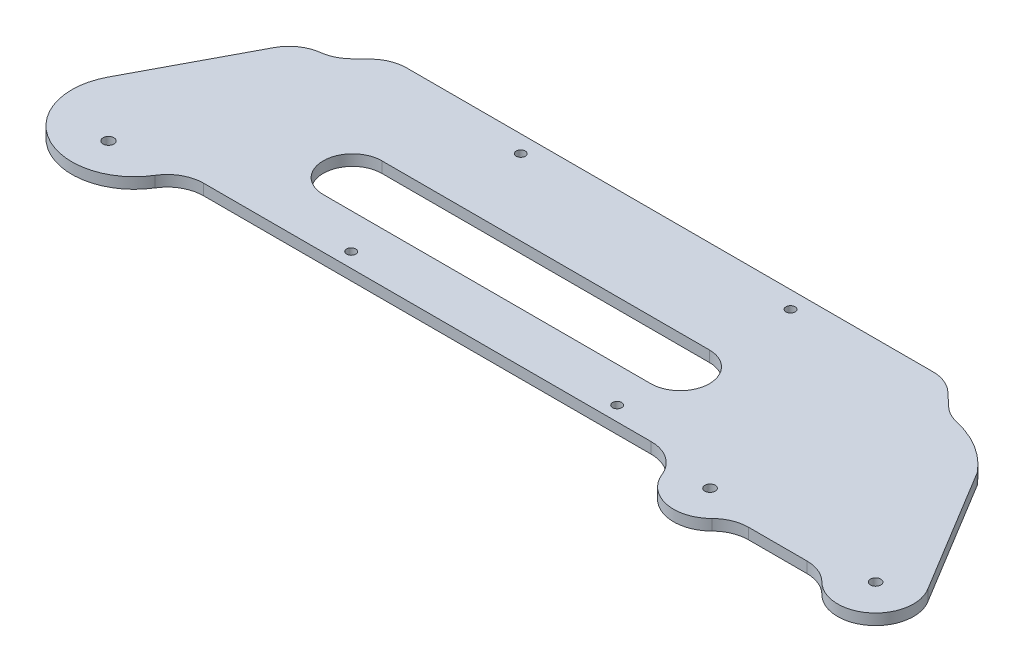
ISO-10303-21;
HEADER;
FILE_DESCRIPTION(('STEP AP214'),'2;1');
FILE_NAME('part.step','',(''),(''),'','','');
FILE_SCHEMA(('AUTOMOTIVE_DESIGN { 1 0 10303 214 1 1 1 1 }'));
ENDSEC;
DATA;
#1=APPLICATION_CONTEXT('core data for automotive mechanical design processes');
#2=APPLICATION_PROTOCOL_DEFINITION('international standard','automotive_design',2000,#1);
#3=PRODUCT_CONTEXT('',#1,'mechanical');
#4=PRODUCT('Part','Part','',(#3));
#5=PRODUCT_RELATED_PRODUCT_CATEGORY('part','',(#4));
#6=PRODUCT_DEFINITION_FORMATION('','',#4);
#7=PRODUCT_DEFINITION_CONTEXT('part definition',#1,'design');
#8=PRODUCT_DEFINITION('design','',#6,#7);
#9=PRODUCT_DEFINITION_SHAPE('','',#8);
#10=(LENGTH_UNIT() NAMED_UNIT(*) SI_UNIT(.MILLI.,.METRE.));
#11=(NAMED_UNIT(*) PLANE_ANGLE_UNIT() SI_UNIT($,.RADIAN.));
#12=(NAMED_UNIT(*) SI_UNIT($,.STERADIAN.) SOLID_ANGLE_UNIT());
#13=UNCERTAINTY_MEASURE_WITH_UNIT(LENGTH_MEASURE(1.E-05),#10,'distance_accuracy_value','');
#14=(GEOMETRIC_REPRESENTATION_CONTEXT(3) GLOBAL_UNCERTAINTY_ASSIGNED_CONTEXT((#13)) GLOBAL_UNIT_ASSIGNED_CONTEXT((#10,
#11,#12)) REPRESENTATION_CONTEXT('',''));
#15=CARTESIAN_POINT('',(0.,0.,0.));
#16=DIRECTION('',(0.,0.,1.));
#17=DIRECTION('',(1.,0.,0.));
#18=AXIS2_PLACEMENT_3D('',#15,#16,#17);
#19=CARTESIAN_POINT('',(0.,3.,3.98878710659487));
#20=DIRECTION('',(0.,0.,-1.));
#21=DIRECTION('',(-1.,0.,0.));
#22=AXIS2_PLACEMENT_3D('',#19,#20,#21);
#23=PLANE('',#22);
#24=DIRECTION('',(1.,0.,0.));
#25=VECTOR('',#24,1.);
#26=CARTESIAN_POINT('',(0.,0.,3.98878710659487));
#27=LINE('',#26,#25);
#28=CARTESIAN_POINT('',(115.459323643184,0.,3.98878710659487));
#29=VERTEX_POINT('',#28);
#30=CARTESIAN_POINT('',(131.450346558864,0.,3.98878710659487));
#31=VERTEX_POINT('',#30);
#32=EDGE_CURVE('E283',#29,#31,#27,.T.);
#33=ORIENTED_EDGE('',*,*,#32,.T.);
#34=DIRECTION('',(0.,1.,0.));
#35=VECTOR('',#34,1.);
#36=CARTESIAN_POINT('',(131.450346558864,3.,3.98878710659487));
#37=LINE('',#36,#35);
#38=CARTESIAN_POINT('',(131.450346558864,3.,3.98878710659487));
#39=VERTEX_POINT('',#38);
#40=EDGE_CURVE('E348',#31,#39,#37,.T.);
#41=ORIENTED_EDGE('',*,*,#40,.T.);
#42=DIRECTION('',(1.,0.,0.));
#43=VECTOR('',#42,1.);
#44=CARTESIAN_POINT('',(0.,3.,3.98878710659487));
#45=LINE('',#44,#43);
#46=CARTESIAN_POINT('',(115.459323643184,3.,3.98878710659487));
#47=VERTEX_POINT('',#46);
#48=EDGE_CURVE('E243',#47,#39,#45,.T.);
#49=ORIENTED_EDGE('',*,*,#48,.F.);
#50=DIRECTION('',(0.,1.,0.));
#51=VECTOR('',#50,1.);
#52=CARTESIAN_POINT('',(115.459323643184,0.,3.98878710659487));
#53=LINE('',#52,#51);
#54=EDGE_CURVE('E345',#47,#29,#53,.F.);
#55=ORIENTED_EDGE('',*,*,#54,.T.);
#56=EDGE_LOOP('',(#33,#41,#49,#55));
#57=FACE_BOUND('',#56,.T.);
#58=ADVANCED_FACE('F37',(#57),#23,.F.);
#59=CARTESIAN_POINT('',(145.916308106567,3.,-0.411747870273778));
#60=DIRECTION('',(0.,-1.,0.));
#61=DIRECTION('',(0.,0.,-1.));
#62=AXIS2_PLACEMENT_3D('',#59,#60,#61);
#63=CYLINDRICAL_SURFACE('',#62,10.4117478702737);
#64=CARTESIAN_POINT('',(145.916308106567,3.,-0.411747870273778));
#65=DIRECTION('',(0.,1.,0.));
#66=DIRECTION('',(0.,0.,1.));
#67=AXIS2_PLACEMENT_3D('',#64,#65,#66);
#68=CIRCLE('',#67,10.4117478702737);
#69=CARTESIAN_POINT('',(138.537422903154,3.,6.93376415197539));
#70=VERTEX_POINT('',#69);
#71=CARTESIAN_POINT('',(154.629343476195,3.,-6.11152930132504));
#72=VERTEX_POINT('',#71);
#73=EDGE_CURVE('E246',#70,#72,#68,.T.);
#74=ORIENTED_EDGE('',*,*,#73,.F.);
#75=DIRECTION('',(0.,-1.,0.));
#76=VECTOR('',#75,1.);
#77=CARTESIAN_POINT('',(138.537422903154,3.,6.93376415197539));
#78=LINE('',#77,#76);
#79=CARTESIAN_POINT('',(138.537422903154,0.,6.93376415197539));
#80=VERTEX_POINT('',#79);
#81=EDGE_CURVE('E328',#70,#80,#78,.T.);
#82=ORIENTED_EDGE('',*,*,#81,.T.);
#83=CARTESIAN_POINT('',(145.916308106567,0.,-0.411747870273778));
#84=DIRECTION('',(0.,1.,0.));
#85=DIRECTION('',(0.,0.,1.));
#86=AXIS2_PLACEMENT_3D('',#83,#84,#85);
#87=CIRCLE('',#86,10.4117478702737);
#88=CARTESIAN_POINT('',(154.629343476195,0.,-6.11152930132504));
#89=VERTEX_POINT('',#88);
#90=EDGE_CURVE('E286',#80,#89,#87,.T.);
#91=ORIENTED_EDGE('',*,*,#90,.T.);
#92=DIRECTION('',(0.,-1.,0.));
#93=VECTOR('',#92,1.);
#94=CARTESIAN_POINT('',(154.629343476195,3.,-6.11152930132504));
#95=LINE('',#94,#93);
#96=EDGE_CURVE('E316',#72,#89,#95,.T.);
#97=ORIENTED_EDGE('',*,*,#96,.F.);
#98=EDGE_LOOP('',(#74,#82,#91,#97));
#99=FACE_BOUND('',#98,.T.);
#100=ADVANCED_FACE('F461',(#99),#63,.T.);
#101=CARTESIAN_POINT('',(115.773864047395,3.,-70.1958174543841));
#102=DIRECTION('',(-0.855100127852066,0.,0.518462892931963));
#103=DIRECTION('',(0.518462892931963,0.,0.855100127852066));
#104=AXIS2_PLACEMENT_3D('',#101,#102,#103);
#105=PLANE('',#104);
#106=DIRECTION('',(-0.518462892931963,0.,-0.855100127852066));
#107=VECTOR('',#106,1.);
#108=CARTESIAN_POINT('',(115.773864047395,0.,-70.1958174543841));
#109=LINE('',#108,#107);
#110=CARTESIAN_POINT('',(133.875699804074,0.,-40.3404849302778));
#111=VERTEX_POINT('',#110);
#112=EDGE_CURVE('E288',#89,#111,#109,.T.);
#113=ORIENTED_EDGE('',*,*,#112,.T.);
#114=DIRECTION('',(0.,-1.,0.));
#115=VECTOR('',#114,1.);
#116=CARTESIAN_POINT('',(133.875699804074,3.,-40.3404849302778));
#117=LINE('',#116,#115);
#118=CARTESIAN_POINT('',(133.875699804074,3.,-40.3404849302778));
#119=VERTEX_POINT('',#118);
#120=EDGE_CURVE('E313',#119,#111,#117,.T.);
#121=ORIENTED_EDGE('',*,*,#120,.F.);
#122=DIRECTION('',(-0.518462892931963,0.,-0.855100127852066));
#123=VECTOR('',#122,1.);
#124=CARTESIAN_POINT('',(115.773864047395,3.,-70.1958174543841));
#125=LINE('',#124,#123);
#126=EDGE_CURVE('E248',#72,#119,#125,.T.);
#127=ORIENTED_EDGE('',*,*,#126,.F.);
#128=ORIENTED_EDGE('',*,*,#96,.T.);
#129=EDGE_LOOP('',(#113,#121,#127,#128));
#130=FACE_BOUND('',#129,.T.);
#131=ADVANCED_FACE('F467',(#130),#105,.F.);
#132=CARTESIAN_POINT('',(113.201681013522,3.,-23.6083244973051));
#133=DIRECTION('',(0.,-1.,0.));
#134=DIRECTION('',(0.,0.,-1.));
#135=AXIS2_PLACEMENT_3D('',#132,#133,#134);
#136=CYLINDRICAL_SURFACE('',#135,26.5966209452791);
#137=CARTESIAN_POINT('',(113.201681013522,0.,-23.6083244973051));
#138=DIRECTION('',(0.,1.,0.));
#139=DIRECTION('',(0.,0.,1.));
#140=AXIS2_PLACEMENT_3D('',#137,#138,#139);
#141=CIRCLE('',#140,26.5966209452791);
#142=CARTESIAN_POINT('',(119.005178449819,0.,-49.5640495539039));
#143=VERTEX_POINT('',#142);
#144=EDGE_CURVE('E290',#111,#143,#141,.T.);
#145=ORIENTED_EDGE('',*,*,#144,.T.);
#146=DIRECTION('',(0.,-1.,0.));
#147=VECTOR('',#146,1.);
#148=CARTESIAN_POINT('',(119.005178449819,3.,-49.5640495539039));
#149=LINE('',#148,#147);
#150=CARTESIAN_POINT('',(119.005178449819,3.,-49.5640495539039));
#151=VERTEX_POINT('',#150);
#152=EDGE_CURVE('E401',#143,#151,#149,.F.);
#153=ORIENTED_EDGE('',*,*,#152,.T.);
#154=CARTESIAN_POINT('',(113.201681013522,3.,-23.6083244973051));
#155=DIRECTION('',(0.,1.,0.));
#156=DIRECTION('',(0.,0.,1.));
#157=AXIS2_PLACEMENT_3D('',#154,#155,#156);
#158=CIRCLE('',#157,26.5966209452791);
#159=EDGE_CURVE('E250',#119,#151,#158,.T.);
#160=ORIENTED_EDGE('',*,*,#159,.F.);
#161=ORIENTED_EDGE('',*,*,#120,.T.);
#162=EDGE_LOOP('',(#145,#153,#160,#161));
#163=FACE_BOUND('',#162,.T.);
#164=ADVANCED_FACE('F699',(#163),#136,.T.);
#165=CARTESIAN_POINT('',(79.816514269489,3.,-84.6046606298297));
#166=DIRECTION('',(0.686224051017765,0.,-0.727390233509337));
#167=DIRECTION('',(-0.727390233509337,0.,-0.686224051017765));
#168=AXIS2_PLACEMENT_3D('',#165,#166,#167);
#169=PLANE('',#168);
#170=DIRECTION('',(0.727390233509337,0.,0.686224051017765));
#171=VECTOR('',#170,1.);
#172=CARTESIAN_POINT('',(79.816514269489,0.,-84.6046606298297));
#173=LINE('',#172,#171);
#174=CARTESIAN_POINT('',(110.658040283019,0.,-55.5085909473065));
#175=VERTEX_POINT('',#174);
#176=CARTESIAN_POINT('',(114.32498108273,0.,-52.0491783040003));
#177=VERTEX_POINT('',#176);
#178=EDGE_CURVE('E293',#175,#177,#173,.T.);
#179=ORIENTED_EDGE('',*,*,#178,.F.);
#180=DIRECTION('',(0.,-1.,0.));
#181=VECTOR('',#180,1.);
#182=CARTESIAN_POINT('',(110.658040283019,3.,-55.5085909473065));
#183=LINE('',#182,#181);
#184=CARTESIAN_POINT('',(110.658040283019,3.,-55.5085909473065));
#185=VERTEX_POINT('',#184);
#186=EDGE_CURVE('E395',#175,#185,#183,.F.);
#187=ORIENTED_EDGE('',*,*,#186,.T.);
#188=DIRECTION('',(0.727390233509337,0.,0.686224051017765));
#189=VECTOR('',#188,1.);
#190=CARTESIAN_POINT('',(79.816514269489,3.,-84.6046606298297));
#191=LINE('',#190,#189);
#192=CARTESIAN_POINT('',(114.32498108273,3.,-52.0491783040003));
#193=VERTEX_POINT('',#192);
#194=EDGE_CURVE('E253',#185,#193,#191,.T.);
#195=ORIENTED_EDGE('',*,*,#194,.T.);
#196=DIRECTION('',(0.,-1.,0.));
#197=VECTOR('',#196,1.);
#198=CARTESIAN_POINT('',(114.32498108273,3.,-52.0491783040003));
#199=LINE('',#198,#197);
#200=EDGE_CURVE('E392',#193,#177,#199,.T.);
#201=ORIENTED_EDGE('',*,*,#200,.T.);
#202=EDGE_LOOP('',(#179,#187,#195,#201));
#203=FACE_BOUND('',#202,.T.);
#204=ADVANCED_FACE('F478',(#203),#169,.T.);
#205=CARTESIAN_POINT('',(0.,3.,-58.2346886122131));
#206=DIRECTION('',(0.,0.,-1.));
#207=DIRECTION('',(-1.,0.,0.));
#208=AXIS2_PLACEMENT_3D('',#205,#206,#207);
#209=PLANE('',#208);
#210=DIRECTION('',(1.,0.,0.));
#211=VECTOR('',#210,1.);
#212=CARTESIAN_POINT('',(0.,3.,-58.2346886122131));
#213=LINE('',#212,#211);
#214=CARTESIAN_POINT('',(-40.5741850886376,3.,-58.2346886122131));
#215=VERTEX_POINT('',#214);
#216=CARTESIAN_POINT('',(103.795799772842,3.,-58.2346886122131));
#217=VERTEX_POINT('',#216);
#218=EDGE_CURVE('E256',#215,#217,#213,.T.);
#219=ORIENTED_EDGE('',*,*,#218,.T.);
#220=DIRECTION('',(0.,-1.,0.));
#221=VECTOR('',#220,1.);
#222=CARTESIAN_POINT('',(103.795799772842,3.,-58.2346886122131));
#223=LINE('',#222,#221);
#224=CARTESIAN_POINT('',(103.795799772842,0.,-58.2346886122131));
#225=VERTEX_POINT('',#224);
#226=EDGE_CURVE('E385',#217,#225,#223,.T.);
#227=ORIENTED_EDGE('',*,*,#226,.T.);
#228=DIRECTION('',(1.,0.,0.));
#229=VECTOR('',#228,1.);
#230=CARTESIAN_POINT('',(0.,0.,-58.2346886122131));
#231=LINE('',#230,#229);
#232=CARTESIAN_POINT('',(-40.5741850886376,0.,-58.2346886122131));
#233=VERTEX_POINT('',#232);
#234=EDGE_CURVE('E296',#233,#225,#231,.T.);
#235=ORIENTED_EDGE('',*,*,#234,.F.);
#236=DIRECTION('',(0.,-1.,0.));
#237=VECTOR('',#236,1.);
#238=CARTESIAN_POINT('',(-40.5741850886376,3.,-58.2346886122131));
#239=LINE('',#238,#237);
#240=EDGE_CURVE('E383',#233,#215,#239,.F.);
#241=ORIENTED_EDGE('',*,*,#240,.T.);
#242=EDGE_LOOP('',(#219,#227,#235,#241));
#243=FACE_BOUND('',#242,.T.);
#244=ADVANCED_FACE('F487',(#243),#209,.T.);
#245=CARTESIAN_POINT('',(-50.0452379142272,3.,-53.0474226871968));
#246=DIRECTION('',(0.686224051017767,0.,0.727390233509335));
#247=DIRECTION('',(0.727390233509335,0.,-0.686224051017767));
#248=AXIS2_PLACEMENT_3D('',#245,#246,#247);
#249=PLANE('',#248);
#250=DIRECTION('',(-0.727390233509335,0.,0.686224051017767));
#251=VECTOR('',#250,1.);
#252=CARTESIAN_POINT('',(-50.0452379142272,0.,-53.0474226871968));
#253=LINE('',#252,#251);
#254=CARTESIAN_POINT('',(-47.4364255988153,0.,-55.5085909473065));
#255=VERTEX_POINT('',#254);
#256=CARTESIAN_POINT('',(-50.3858390380866,0.,-52.7260976649066));
#257=VERTEX_POINT('',#256);
#258=EDGE_CURVE('E299',#255,#257,#253,.T.);
#259=ORIENTED_EDGE('',*,*,#258,.T.);
#260=DIRECTION('',(0.,-1.,0.));
#261=VECTOR('',#260,1.);
#262=CARTESIAN_POINT('',(-50.3858390380866,3.,-52.7260976649066));
#263=LINE('',#262,#261);
#264=CARTESIAN_POINT('',(-50.3858390380866,3.,-52.7260976649066));
#265=VERTEX_POINT('',#264);
#266=EDGE_CURVE('E381',#257,#265,#263,.F.);
#267=ORIENTED_EDGE('',*,*,#266,.T.);
#268=DIRECTION('',(-0.727390233509335,0.,0.686224051017767));
#269=VECTOR('',#268,1.);
#270=CARTESIAN_POINT('',(-50.0452379142272,3.,-53.0474226871968));
#271=LINE('',#270,#269);
#272=CARTESIAN_POINT('',(-47.4364255988153,3.,-55.5085909473065));
#273=VERTEX_POINT('',#272);
#274=EDGE_CURVE('E259',#273,#265,#271,.T.);
#275=ORIENTED_EDGE('',*,*,#274,.F.);
#276=DIRECTION('',(0.,-1.,0.));
#277=VECTOR('',#276,1.);
#278=CARTESIAN_POINT('',(-47.4364255988153,0.,-55.5085909473065));
#279=LINE('',#278,#277);
#280=EDGE_CURVE('E378',#273,#255,#279,.T.);
#281=ORIENTED_EDGE('',*,*,#280,.T.);
#282=EDGE_LOOP('',(#259,#267,#275,#281));
#283=FACE_BOUND('',#282,.T.);
#284=ADVANCED_FACE('F497',(#283),#249,.F.);
#285=CARTESIAN_POINT('',(-68.1933037266215,3.,-36.0979629434998));
#286=DIRECTION('',(-0.883811358522081,0.,-0.467843438072346));
#287=DIRECTION('',(-0.467843438072346,0.,0.883811358522081));
#288=AXIS2_PLACEMENT_3D('',#285,#286,#287);
#289=PLANE('',#288);
#290=DIRECTION('',(0.467843438072346,0.,-0.883811358522081));
#291=VECTOR('',#290,1.);
#292=CARTESIAN_POINT('',(-68.1933037266215,3.,-36.0979629434998));
#293=LINE('',#292,#291);
#294=CARTESIAN_POINT('',(-79.287118585281,3.,-15.1404400127024));
#295=VERTEX_POINT('',#294);
#296=CARTESIAN_POINT('',(-63.5669253733636,3.,-44.8377365615233));
#297=VERTEX_POINT('',#296);
#298=EDGE_CURVE('E262',#295,#297,#293,.T.);
#299=ORIENTED_EDGE('',*,*,#298,.T.);
#300=DIRECTION('',(0.,-1.,0.));
#301=VECTOR('',#300,1.);
#302=CARTESIAN_POINT('',(-63.5669253733636,0.,-44.8377365615233));
#303=LINE('',#302,#301);
#304=CARTESIAN_POINT('',(-63.5669253733636,0.,-44.8377365615233));
#305=VERTEX_POINT('',#304);
#306=EDGE_CURVE('E411',#297,#305,#303,.T.);
#307=ORIENTED_EDGE('',*,*,#306,.T.);
#308=DIRECTION('',(0.467843438072346,0.,-0.883811358522081));
#309=VECTOR('',#308,1.);
#310=CARTESIAN_POINT('',(-68.1933037266215,0.,-36.0979629434998));
#311=LINE('',#310,#309);
#312=CARTESIAN_POINT('',(-79.287118585281,0.,-15.1404400127024));
#313=VERTEX_POINT('',#312);
#314=EDGE_CURVE('E302',#313,#305,#311,.T.);
#315=ORIENTED_EDGE('',*,*,#314,.F.);
#316=DIRECTION('',(0.,-1.,0.));
#317=VECTOR('',#316,1.);
#318=CARTESIAN_POINT('',(-79.287118585281,3.,-15.1404400127024));
#319=LINE('',#318,#317);
#320=EDGE_CURVE('E274',#295,#313,#319,.T.);
#321=ORIENTED_EDGE('',*,*,#320,.F.);
#322=EDGE_LOOP('',(#299,#307,#315,#321));
#323=FACE_BOUND('',#322,.T.);
#324=ADVANCED_FACE('F417',(#323),#289,.T.);
#325=CARTESIAN_POINT('',(-64.1496687284699,3.,-7.1274669768039));
#326=DIRECTION('',(0.,-1.,0.));
#327=DIRECTION('',(0.,0.,-1.));
#328=AXIS2_PLACEMENT_3D('',#325,#326,#327);
#329=CYLINDRICAL_SURFACE('',#328,17.1274669768039);
#330=CARTESIAN_POINT('',(-64.1496687284699,0.,-7.1274669768039));
#331=DIRECTION('',(0.,1.,0.));
#332=DIRECTION('',(0.,0.,1.));
#333=AXIS2_PLACEMENT_3D('',#330,#331,#332);
#334=CIRCLE('',#333,17.1274669768039);
#335=CARTESIAN_POINT('',(-49.5281151633965,0.,1.79219088576022));
#336=VERTEX_POINT('',#335);
#337=EDGE_CURVE('E304',#313,#336,#334,.T.);
#338=ORIENTED_EDGE('',*,*,#337,.T.);
#339=DIRECTION('',(0.,-1.,0.));
#340=VECTOR('',#339,1.);
#341=CARTESIAN_POINT('',(-49.5281151633965,3.,1.79219088576022));
#342=LINE('',#341,#340);
#343=CARTESIAN_POINT('',(-49.5281151633965,3.,1.79219088576022));
#344=VERTEX_POINT('',#343);
#345=EDGE_CURVE('E360',#336,#344,#342,.F.);
#346=ORIENTED_EDGE('',*,*,#345,.T.);
#347=CARTESIAN_POINT('',(-64.1496687284699,3.,-7.1274669768039));
#348=DIRECTION('',(0.,1.,0.));
#349=DIRECTION('',(0.,0.,1.));
#350=AXIS2_PLACEMENT_3D('',#347,#348,#349);
#351=CIRCLE('',#350,17.1274669768039);
#352=EDGE_CURVE('E265',#295,#344,#351,.T.);
#353=ORIENTED_EDGE('',*,*,#352,.F.);
#354=ORIENTED_EDGE('',*,*,#320,.T.);
#355=EDGE_LOOP('',(#338,#346,#353,#354));
#356=FACE_BOUND('',#355,.T.);
#357=ADVANCED_FACE('F426',(#356),#329,.T.);
#358=CARTESIAN_POINT('',(0.,3.,-2.99999999999997));
#359=DIRECTION('',(0.,0.,-1.));
#360=DIRECTION('',(-1.,0.,0.));
#361=AXIS2_PLACEMENT_3D('',#358,#359,#360);
#362=PLANE('',#361);
#363=DIRECTION('',(1.,0.,0.));
#364=VECTOR('',#363,1.);
#365=CARTESIAN_POINT('',(0.,0.,-2.99999999999997));
#366=LINE('',#365,#364);
#367=CARTESIAN_POINT('',(-40.9912114958107,0.,-2.99999999999997));
#368=VERTEX_POINT('',#367);
#369=CARTESIAN_POINT('',(81.7710875952923,0.,-2.99999999999997));
#370=VERTEX_POINT('',#369);
#371=EDGE_CURVE('E307',#368,#370,#366,.T.);
#372=ORIENTED_EDGE('',*,*,#371,.T.);
#373=DIRECTION('',(0.,1.,0.));
#374=VECTOR('',#373,1.);
#375=CARTESIAN_POINT('',(81.7710875952923,3.,-2.99999999999997));
#376=LINE('',#375,#374);
#377=CARTESIAN_POINT('',(81.7710875952923,3.,-2.99999999999997));
#378=VERTEX_POINT('',#377);
#379=EDGE_CURVE('E358',#370,#378,#376,.T.);
#380=ORIENTED_EDGE('',*,*,#379,.T.);
#381=DIRECTION('',(1.,0.,0.));
#382=VECTOR('',#381,1.);
#383=CARTESIAN_POINT('',(0.,3.,-2.99999999999997));
#384=LINE('',#383,#382);
#385=CARTESIAN_POINT('',(-40.9912114958107,3.,-2.99999999999997));
#386=VERTEX_POINT('',#385);
#387=EDGE_CURVE('E268',#386,#378,#384,.T.);
#388=ORIENTED_EDGE('',*,*,#387,.F.);
#389=DIRECTION('',(0.,1.,0.));
#390=VECTOR('',#389,1.);
#391=CARTESIAN_POINT('',(-40.9912114958107,0.,-2.99999999999997));
#392=LINE('',#391,#390);
#393=EDGE_CURVE('E355',#386,#368,#392,.F.);
#394=ORIENTED_EDGE('',*,*,#393,.T.);
#395=EDGE_LOOP('',(#372,#380,#388,#394));
#396=FACE_BOUND('',#395,.T.);
#397=ADVANCED_FACE('F436',(#396),#362,.F.);
#398=CARTESIAN_POINT('',(-64.0836918934332,3.,0.));
#399=DIRECTION('',(0.,-1.,0.));
#400=DIRECTION('',(0.,0.,-1.));
#401=AXIS2_PLACEMENT_3D('',#398,#399,#400);
#402=CYLINDRICAL_SURFACE('',#401,1.5);
#403=CARTESIAN_POINT('',(-64.0836918934332,3.,0.));
#404=DIRECTION('',(0.,1.,0.));
#405=DIRECTION('',(0.,0.,1.));
#406=AXIS2_PLACEMENT_3D('',#403,#404,#405);
#407=CIRCLE('',#406,1.5);
#408=CARTESIAN_POINT('',(-64.0836918934332,3.,1.50000000000003));
#409=VERTEX_POINT('',#408);
#410=EDGE_CURVE('E240',#409,#409,#407,.T.);
#411=ORIENTED_EDGE('',*,*,#410,.T.);
#412=EDGE_LOOP('',(#411));
#413=FACE_BOUND('',#412,.T.);
#414=CARTESIAN_POINT('',(-64.0836918934332,0.,0.));
#415=DIRECTION('',(0.,1.,0.));
#416=DIRECTION('',(0.,0.,1.));
#417=AXIS2_PLACEMENT_3D('',#414,#415,#416);
#418=CIRCLE('',#417,1.5);
#419=CARTESIAN_POINT('',(-64.0836918934332,0.,1.50000000000003));
#420=VERTEX_POINT('',#419);
#421=EDGE_CURVE('E280',#420,#420,#418,.T.);
#422=ORIENTED_EDGE('',*,*,#421,.F.);
#423=EDGE_LOOP('',(#422));
#424=FACE_BOUND('',#423,.T.);
#425=ADVANCED_FACE('F512',(#413,#424),#402,.F.);
#426=CARTESIAN_POINT('',(100.916308106567,3.,0.));
#427=DIRECTION('',(0.,-1.,0.));
#428=DIRECTION('',(0.,0.,-1.));
#429=AXIS2_PLACEMENT_3D('',#426,#427,#428);
#430=CYLINDRICAL_SURFACE('',#429,1.42000000000001);
#431=CARTESIAN_POINT('',(100.916308106567,3.,0.));
#432=DIRECTION('',(0.,1.,0.));
#433=DIRECTION('',(0.,0.,1.));
#434=AXIS2_PLACEMENT_3D('',#431,#432,#433);
#435=CIRCLE('',#434,1.42000000000001);
#436=CARTESIAN_POINT('',(100.916308106567,3.,1.42000000000004));
#437=VERTEX_POINT('',#436);
#438=EDGE_CURVE('E236',#437,#437,#435,.T.);
#439=ORIENTED_EDGE('',*,*,#438,.T.);
#440=EDGE_LOOP('',(#439));
#441=FACE_BOUND('',#440,.T.);
#442=CARTESIAN_POINT('',(100.916308106567,0.,0.));
#443=DIRECTION('',(0.,1.,0.));
#444=DIRECTION('',(0.,0.,1.));
#445=AXIS2_PLACEMENT_3D('',#442,#443,#444);
#446=CIRCLE('',#445,1.42000000000001);
#447=CARTESIAN_POINT('',(100.916308106567,0.,1.42000000000004));
#448=VERTEX_POINT('',#447);
#449=EDGE_CURVE('E277',#448,#448,#446,.T.);
#450=ORIENTED_EDGE('',*,*,#449,.F.);
#451=EDGE_LOOP('',(#450));
#452=FACE_BOUND('',#451,.T.);
#453=ADVANCED_FACE('F515',(#441,#452),#430,.F.);
#454=CARTESIAN_POINT('',(145.916308106567,3.,-0.411747870273778));
#455=DIRECTION('',(0.,-1.,0.));
#456=DIRECTION('',(0.,0.,-1.));
#457=AXIS2_PLACEMENT_3D('',#454,#455,#456);
#458=CYLINDRICAL_SURFACE('',#457,1.42);
#459=CARTESIAN_POINT('',(145.916308106567,3.,-0.411747870273778));
#460=DIRECTION('',(0.,1.,0.));
#461=DIRECTION('',(0.,0.,1.));
#462=AXIS2_PLACEMENT_3D('',#459,#460,#461);
#463=CIRCLE('',#462,1.42);
#464=CARTESIAN_POINT('',(145.916308106567,3.,1.00825212972622));
#465=VERTEX_POINT('',#464);
#466=EDGE_CURVE('E233',#465,#465,#463,.T.);
#467=ORIENTED_EDGE('',*,*,#466,.T.);
#468=EDGE_LOOP('',(#467));
#469=FACE_BOUND('',#468,.T.);
#470=CARTESIAN_POINT('',(145.916308106567,0.,-0.411747870273778));
#471=DIRECTION('',(0.,1.,0.));
#472=DIRECTION('',(0.,0.,1.));
#473=AXIS2_PLACEMENT_3D('',#470,#471,#472);
#474=CIRCLE('',#473,1.42);
#475=CARTESIAN_POINT('',(145.916308106567,0.,1.00825212972622));
#476=VERTEX_POINT('',#475);
#477=EDGE_CURVE('E230',#476,#476,#474,.T.);
#478=ORIENTED_EDGE('',*,*,#477,.F.);
#479=EDGE_LOOP('',(#478));
#480=FACE_BOUND('',#479,.T.);
#481=ADVANCED_FACE('F519',(#469,#480),#458,.F.);
#482=CARTESIAN_POINT('',(100.916308106567,3.,-0.597671862512552));
#483=DIRECTION('',(0.,-1.,0.));
#484=DIRECTION('',(0.,0.,-1.));
#485=AXIS2_PLACEMENT_3D('',#482,#483,#484);
#486=CYLINDRICAL_SURFACE('',#485,10.5976718625125);
#487=CARTESIAN_POINT('',(100.916308106567,0.,-0.597671862512552));
#488=DIRECTION('',(0.,1.,0.));
#489=DIRECTION('',(0.,0.,1.));
#490=AXIS2_PLACEMENT_3D('',#487,#488,#489);
#491=CIRCLE('',#490,10.5976718625125);
#492=CARTESIAN_POINT('',(91.0659344299574,0.,3.31139290244731));
#493=VERTEX_POINT('',#492);
#494=CARTESIAN_POINT('',(108.398809409493,0.,6.90718144432846));
#495=VERTEX_POINT('',#494);
#496=EDGE_CURVE('E237',#493,#495,#491,.T.);
#497=ORIENTED_EDGE('',*,*,#496,.T.);
#498=DIRECTION('',(0.,-1.,0.));
#499=VECTOR('',#498,1.);
#500=CARTESIAN_POINT('',(108.398809409493,3.,6.90718144432846));
#501=LINE('',#500,#499);
#502=CARTESIAN_POINT('',(108.398809409493,3.,6.90718144432846));
#503=VERTEX_POINT('',#502);
#504=EDGE_CURVE('E353',#495,#503,#501,.F.);
#505=ORIENTED_EDGE('',*,*,#504,.T.);
#506=CARTESIAN_POINT('',(100.916308106567,3.,-0.597671862512552));
#507=DIRECTION('',(0.,1.,0.));
#508=DIRECTION('',(0.,0.,1.));
#509=AXIS2_PLACEMENT_3D('',#506,#507,#508);
#510=CIRCLE('',#509,10.5976718625125);
#511=CARTESIAN_POINT('',(91.0659344299574,3.,3.31139290244731));
#512=VERTEX_POINT('',#511);
#513=EDGE_CURVE('E271',#512,#503,#510,.T.);
#514=ORIENTED_EDGE('',*,*,#513,.F.);
#515=DIRECTION('',(0.,-1.,0.));
#516=VECTOR('',#515,1.);
#517=CARTESIAN_POINT('',(91.0659344299574,3.,3.3113929024473));
#518=LINE('',#517,#516);
#519=EDGE_CURVE('E350',#512,#493,#518,.T.);
#520=ORIENTED_EDGE('',*,*,#519,.T.);
#521=EDGE_LOOP('',(#497,#505,#514,#520));
#522=FACE_BOUND('',#521,.T.);
#523=ADVANCED_FACE('F444',(#522),#486,.T.);
#524=CARTESIAN_POINT('',(0.,3.,0.));
#525=DIRECTION('',(0.,1.,0.));
#526=DIRECTION('',(0.,0.,1.));
#527=AXIS2_PLACEMENT_3D('',#524,#525,#526);
#528=PLANE('',#527);
#529=CARTESIAN_POINT('',(68.4468886982188,3.,-6.99999999999997));
#530=DIRECTION('',(0.,1.,0.));
#531=DIRECTION('',(0.,0.,1.));
#532=AXIS2_PLACEMENT_3D('',#529,#530,#531);
#533=CIRCLE('',#532,1.25);
#534=CARTESIAN_POINT('',(68.4468886982188,3.,-5.74999999999997));
#535=VERTEX_POINT('',#534);
#536=EDGE_CURVE('E337',#535,#535,#533,.T.);
#537=ORIENTED_EDGE('',*,*,#536,.F.);
#538=EDGE_LOOP('',(#537));
#539=FACE_BOUND('',#538,.T.);
#540=CARTESIAN_POINT('',(-4.51501569364154,3.,-53.5183699152526));
#541=DIRECTION('',(0.,1.,0.));
#542=DIRECTION('',(0.,0.,1.));
#543=AXIS2_PLACEMENT_3D('',#540,#541,#542);
#544=CIRCLE('',#543,1.25);
#545=CARTESIAN_POINT('',(-4.51501569364154,3.,-52.2683699152526));
#546=VERTEX_POINT('',#545);
#547=EDGE_CURVE('E864',#546,#546,#544,.T.);
#548=ORIENTED_EDGE('',*,*,#547,.F.);
#549=EDGE_LOOP('',(#548));
#550=FACE_BOUND('',#549,.T.);
#551=CARTESIAN_POINT('',(69.4807048098909,3.,-53.5183699152526));
#552=DIRECTION('',(0.,1.,0.));
#553=DIRECTION('',(0.,0.,1.));
#554=AXIS2_PLACEMENT_3D('',#551,#552,#553);
#555=CIRCLE('',#554,1.25);
#556=CARTESIAN_POINT('',(69.4807048098909,3.,-52.2683699152526));
#557=VERTEX_POINT('',#556);
#558=EDGE_CURVE('E861',#557,#557,#555,.T.);
#559=ORIENTED_EDGE('',*,*,#558,.F.);
#560=EDGE_LOOP('',(#559));
#561=FACE_BOUND('',#560,.T.);
#562=CARTESIAN_POINT('',(-4.51501569364154,3.,-6.99999999999997));
#563=DIRECTION('',(0.,1.,0.));
#564=DIRECTION('',(0.,0.,1.));
#565=AXIS2_PLACEMENT_3D('',#562,#563,#564);
#566=CIRCLE('',#565,1.25);
#567=CARTESIAN_POINT('',(-4.51501569364154,3.,-5.74999999999997));
#568=VERTEX_POINT('',#567);
#569=EDGE_CURVE('E332',#568,#568,#566,.T.);
#570=ORIENTED_EDGE('',*,*,#569,.F.);
#571=EDGE_LOOP('',(#570));
#572=FACE_BOUND('',#571,.T.);
#573=CARTESIAN_POINT('',(67.9726109987371,3.,-24.7356567233048));
#574=DIRECTION('',(0.,1.,0.));
#575=DIRECTION('',(0.,0.,1.));
#576=AXIS2_PLACEMENT_3D('',#573,#574,#575);
#577=CIRCLE('',#576,8.0302910543697);
#578=CARTESIAN_POINT('',(67.9726109987371,3.,-16.7053656689351));
#579=VERTEX_POINT('',#578);
#580=CARTESIAN_POINT('',(67.9726109987371,3.,-32.7659477776745));
#581=VERTEX_POINT('',#580);
#582=EDGE_CURVE('E218',#579,#581,#577,.T.);
#583=ORIENTED_EDGE('',*,*,#582,.F.);
#584=DIRECTION('',(1.,0.,0.));
#585=VECTOR('',#584,1.);
#586=CARTESIAN_POINT('',(67.9726109987371,3.,-16.7053656689351));
#587=LINE('',#586,#585);
#588=CARTESIAN_POINT('',(-21.876516483502,3.,-16.7053656689351));
#589=VERTEX_POINT('',#588);
#590=EDGE_CURVE('E223',#589,#579,#587,.T.);
#591=ORIENTED_EDGE('',*,*,#590,.F.);
#592=CARTESIAN_POINT('',(-21.876516483502,3.,-24.7356567233048));
#593=DIRECTION('',(0.,1.,0.));
#594=DIRECTION('',(0.,0.,1.));
#595=AXIS2_PLACEMENT_3D('',#592,#593,#594);
#596=CIRCLE('',#595,8.03029105436969);
#597=CARTESIAN_POINT('',(-21.876516483502,3.,-32.7659477776745));
#598=VERTEX_POINT('',#597);
#599=EDGE_CURVE('E202',#598,#589,#596,.T.);
#600=ORIENTED_EDGE('',*,*,#599,.F.);
#601=DIRECTION('',(-1.,0.,0.));
#602=VECTOR('',#601,1.);
#603=CARTESIAN_POINT('',(67.9726109987371,3.,-32.7659477776745));
#604=LINE('',#603,#602);
#605=EDGE_CURVE('E213',#581,#598,#604,.T.);
#606=ORIENTED_EDGE('',*,*,#605,.F.);
#607=EDGE_LOOP('',(#583,#591,#600,#606));
#608=FACE_BOUND('',#607,.T.);
#609=ORIENTED_EDGE('',*,*,#466,.F.);
#610=EDGE_LOOP('',(#609));
#611=FACE_BOUND('',#610,.T.);
#612=ORIENTED_EDGE('',*,*,#438,.F.);
#613=EDGE_LOOP('',(#612));
#614=FACE_BOUND('',#613,.T.);
#615=ORIENTED_EDGE('',*,*,#410,.F.);
#616=EDGE_LOOP('',(#615));
#617=FACE_BOUND('',#616,.T.);
#618=CARTESIAN_POINT('',(-57.2480795482643,3.,-60.));
#619=DIRECTION('',(0.,1.,0.));
#620=DIRECTION('',(0.,0.,1.));
#621=AXIS2_PLACEMENT_3D('',#618,#619,#620);
#622=CIRCLE('',#621,10.);
#623=CARTESIAN_POINT('',(-55.9884456682035,3.,-50.0796510903999));
#624=VERTEX_POINT('',#623);
#625=EDGE_CURVE('E405',#265,#624,#622,.F.);
#626=ORIENTED_EDGE('',*,*,#625,.T.);
#627=CARTESIAN_POINT('',(-54.7288117881428,3.,-40.1593021807998));
#628=DIRECTION('',(0.,1.,0.));
#629=DIRECTION('',(0.,0.,1.));
#630=AXIS2_PLACEMENT_3D('',#627,#628,#629);
#631=CIRCLE('',#630,10.);
#632=EDGE_CURVE('E11',#624,#297,#631,.T.);
#633=ORIENTED_EDGE('',*,*,#632,.T.);
#634=ORIENTED_EDGE('',*,*,#298,.F.);
#635=ORIENTED_EDGE('',*,*,#352,.T.);
#636=CARTESIAN_POINT('',(-40.9912114958107,3.,7.00000000000003));
#637=DIRECTION('',(0.,1.,0.));
#638=DIRECTION('',(0.,0.,1.));
#639=AXIS2_PLACEMENT_3D('',#636,#637,#638);
#640=CIRCLE('',#639,10.);
#641=EDGE_CURVE('E376',#344,#386,#640,.F.);
#642=ORIENTED_EDGE('',*,*,#641,.T.);
#643=ORIENTED_EDGE('',*,*,#387,.T.);
#644=CARTESIAN_POINT('',(81.7710875952923,3.,7.00000000000003));
#645=DIRECTION('',(0.,1.,0.));
#646=DIRECTION('',(0.,0.,1.));
#647=AXIS2_PLACEMENT_3D('',#644,#645,#646);
#648=CIRCLE('',#647,10.);
#649=EDGE_CURVE('E372',#378,#512,#648,.F.);
#650=ORIENTED_EDGE('',*,*,#649,.T.);
#651=ORIENTED_EDGE('',*,*,#513,.T.);
#652=CARTESIAN_POINT('',(115.459323643184,3.,13.9887871065949));
#653=DIRECTION('',(0.,1.,0.));
#654=DIRECTION('',(0.,0.,1.));
#655=AXIS2_PLACEMENT_3D('',#652,#653,#654);
#656=CIRCLE('',#655,10.);
#657=EDGE_CURVE('E368',#503,#47,#656,.F.);
#658=ORIENTED_EDGE('',*,*,#657,.T.);
#659=ORIENTED_EDGE('',*,*,#48,.T.);
#660=CARTESIAN_POINT('',(131.450346558864,3.,13.9887871065949));
#661=DIRECTION('',(0.,1.,0.));
#662=DIRECTION('',(0.,0.,1.));
#663=AXIS2_PLACEMENT_3D('',#660,#661,#662);
#664=CIRCLE('',#663,10.);
#665=EDGE_CURVE('E364',#39,#70,#664,.F.);
#666=ORIENTED_EDGE('',*,*,#665,.T.);
#667=ORIENTED_EDGE('',*,*,#73,.T.);
#668=ORIENTED_EDGE('',*,*,#126,.T.);
#669=ORIENTED_EDGE('',*,*,#159,.T.);
#670=CARTESIAN_POINT('',(121.187221592907,3.,-59.3230806390937));
#671=DIRECTION('',(0.,1.,0.));
#672=DIRECTION('',(0.,0.,1.));
#673=AXIS2_PLACEMENT_3D('',#670,#671,#672);
#674=CIRCLE('',#673,10.);
#675=EDGE_CURVE('E409',#151,#193,#674,.F.);
#676=ORIENTED_EDGE('',*,*,#675,.T.);
#677=ORIENTED_EDGE('',*,*,#194,.F.);
#678=CARTESIAN_POINT('',(103.795799772842,3.,-48.2346886122131));
#679=DIRECTION('',(0.,1.,0.));
#680=DIRECTION('',(0.,0.,1.));
#681=AXIS2_PLACEMENT_3D('',#678,#679,#680);
#682=CIRCLE('',#681,10.);
#683=EDGE_CURVE('E399',#185,#217,#682,.T.);
#684=ORIENTED_EDGE('',*,*,#683,.T.);
#685=ORIENTED_EDGE('',*,*,#218,.F.);
#686=CARTESIAN_POINT('',(-40.5741850886376,3.,-48.2346886122131));
#687=DIRECTION('',(0.,1.,0.));
#688=DIRECTION('',(0.,0.,1.));
#689=AXIS2_PLACEMENT_3D('',#686,#687,#688);
#690=CIRCLE('',#689,10.);
#691=EDGE_CURVE('E397',#215,#273,#690,.T.);
#692=ORIENTED_EDGE('',*,*,#691,.T.);
#693=ORIENTED_EDGE('',*,*,#274,.T.);
#694=EDGE_LOOP('',(#626,#633,#634,#635,#642,#643,#650,#651,#658,#659,#666,#667,#668,#669,#676,
#677,#684,#685,#692,#693));
#695=FACE_BOUND('',#694,.T.);
#696=ADVANCED_FACE('F220',(#539,#550,#561,#572,#608,#611,#614,#617,#695),#528,.T.);
#697=CARTESIAN_POINT('',(0.,0.,0.));
#698=DIRECTION('',(0.,1.,0.));
#699=DIRECTION('',(0.,0.,1.));
#700=AXIS2_PLACEMENT_3D('',#697,#698,#699);
#701=PLANE('',#700);
#702=CARTESIAN_POINT('',(68.4468886982188,0.,-6.99999999999997));
#703=DIRECTION('',(0.,1.,0.));
#704=DIRECTION('',(0.,0.,1.));
#705=AXIS2_PLACEMENT_3D('',#702,#703,#704);
#706=CIRCLE('',#705,1.25);
#707=CARTESIAN_POINT('',(68.4468886982188,0.,-5.74999999999997));
#708=VERTEX_POINT('',#707);
#709=EDGE_CURVE('E340',#708,#708,#706,.T.);
#710=ORIENTED_EDGE('',*,*,#709,.T.);
#711=EDGE_LOOP('',(#710));
#712=FACE_BOUND('',#711,.T.);
#713=CARTESIAN_POINT('',(-4.51501569364154,0.,-53.5183699152526));
#714=DIRECTION('',(0.,1.,0.));
#715=DIRECTION('',(0.,0.,1.));
#716=AXIS2_PLACEMENT_3D('',#713,#714,#715);
#717=CIRCLE('',#716,1.25);
#718=CARTESIAN_POINT('',(-4.51501569364154,0.,-52.2683699152526));
#719=VERTEX_POINT('',#718);
#720=EDGE_CURVE('E336',#719,#719,#717,.T.);
#721=ORIENTED_EDGE('',*,*,#720,.T.);
#722=EDGE_LOOP('',(#721));
#723=FACE_BOUND('',#722,.T.);
#724=CARTESIAN_POINT('',(69.4807048098909,0.,-53.5183699152526));
#725=DIRECTION('',(0.,1.,0.));
#726=DIRECTION('',(0.,0.,1.));
#727=AXIS2_PLACEMENT_3D('',#724,#725,#726);
#728=CIRCLE('',#727,1.25);
#729=CARTESIAN_POINT('',(69.4807048098909,0.,-52.2683699152526));
#730=VERTEX_POINT('',#729);
#731=EDGE_CURVE('E333',#730,#730,#728,.T.);
#732=ORIENTED_EDGE('',*,*,#731,.T.);
#733=EDGE_LOOP('',(#732));
#734=FACE_BOUND('',#733,.T.);
#735=CARTESIAN_POINT('',(-4.51501569364154,0.,-6.99999999999997));
#736=DIRECTION('',(0.,1.,0.));
#737=DIRECTION('',(0.,0.,1.));
#738=AXIS2_PLACEMENT_3D('',#735,#736,#737);
#739=CIRCLE('',#738,1.25);
#740=CARTESIAN_POINT('',(-4.51501569364154,0.,-5.74999999999997));
#741=VERTEX_POINT('',#740);
#742=EDGE_CURVE('E329',#741,#741,#739,.T.);
#743=ORIENTED_EDGE('',*,*,#742,.T.);
#744=EDGE_LOOP('',(#743));
#745=FACE_BOUND('',#744,.T.);
#746=DIRECTION('',(1.,0.,0.));
#747=VECTOR('',#746,1.);
#748=CARTESIAN_POINT('',(0.,0.,-16.7053656689351));
#749=LINE('',#748,#747);
#750=CARTESIAN_POINT('',(-21.876516483502,0.,-16.7053656689351));
#751=VERTEX_POINT('',#750);
#752=CARTESIAN_POINT('',(67.9726109987371,0.,-16.7053656689351));
#753=VERTEX_POINT('',#752);
#754=EDGE_CURVE('E322',#751,#753,#749,.T.);
#755=ORIENTED_EDGE('',*,*,#754,.T.);
#756=CARTESIAN_POINT('',(67.9726109987371,0.,-24.7356567233048));
#757=DIRECTION('',(0.,1.,0.));
#758=DIRECTION('',(0.,0.,1.));
#759=AXIS2_PLACEMENT_3D('',#756,#757,#758);
#760=CIRCLE('',#759,8.0302910543697);
#761=CARTESIAN_POINT('',(67.9726109987371,0.,-32.7659477776745));
#762=VERTEX_POINT('',#761);
#763=EDGE_CURVE('E325',#753,#762,#760,.T.);
#764=ORIENTED_EDGE('',*,*,#763,.T.);
#765=DIRECTION('',(-1.,0.,0.));
#766=VECTOR('',#765,1.);
#767=CARTESIAN_POINT('',(0.,0.,-32.7659477776745));
#768=LINE('',#767,#766);
#769=CARTESIAN_POINT('',(-21.876516483502,0.,-32.7659477776745));
#770=VERTEX_POINT('',#769);
#771=EDGE_CURVE('E319',#762,#770,#768,.T.);
#772=ORIENTED_EDGE('',*,*,#771,.T.);
#773=CARTESIAN_POINT('',(-21.876516483502,0.,-24.7356567233048));
#774=DIRECTION('',(0.,1.,0.));
#775=DIRECTION('',(0.,0.,1.));
#776=AXIS2_PLACEMENT_3D('',#773,#774,#775);
#777=CIRCLE('',#776,8.03029105436969);
#778=EDGE_CURVE('E205',#770,#751,#777,.T.);
#779=ORIENTED_EDGE('',*,*,#778,.T.);
#780=EDGE_LOOP('',(#755,#764,#772,#779));
#781=FACE_BOUND('',#780,.T.);
#782=ORIENTED_EDGE('',*,*,#477,.T.);
#783=EDGE_LOOP('',(#782));
#784=FACE_BOUND('',#783,.T.);
#785=ORIENTED_EDGE('',*,*,#449,.T.);
#786=EDGE_LOOP('',(#785));
#787=FACE_BOUND('',#786,.T.);
#788=ORIENTED_EDGE('',*,*,#421,.T.);
#789=EDGE_LOOP('',(#788));
#790=FACE_BOUND('',#789,.T.);
#791=ORIENTED_EDGE('',*,*,#314,.T.);
#792=CARTESIAN_POINT('',(-54.7288117881428,0.,-40.1593021807998));
#793=DIRECTION('',(0.,1.,0.));
#794=DIRECTION('',(0.,0.,1.));
#795=AXIS2_PLACEMENT_3D('',#792,#793,#794);
#796=CIRCLE('',#795,10.);
#797=CARTESIAN_POINT('',(-55.9884456682035,0.,-50.0796510903999));
#798=VERTEX_POINT('',#797);
#799=EDGE_CURVE('E59',#305,#798,#796,.F.);
#800=ORIENTED_EDGE('',*,*,#799,.T.);
#801=CARTESIAN_POINT('',(-57.2480795482643,0.,-60.));
#802=DIRECTION('',(0.,1.,0.));
#803=DIRECTION('',(0.,0.,1.));
#804=AXIS2_PLACEMENT_3D('',#801,#802,#803);
#805=CIRCLE('',#804,10.);
#806=EDGE_CURVE('E403',#798,#257,#805,.T.);
#807=ORIENTED_EDGE('',*,*,#806,.T.);
#808=ORIENTED_EDGE('',*,*,#258,.F.);
#809=CARTESIAN_POINT('',(-40.5741850886376,0.,-48.2346886122131));
#810=DIRECTION('',(0.,1.,0.));
#811=DIRECTION('',(0.,0.,1.));
#812=AXIS2_PLACEMENT_3D('',#809,#810,#811);
#813=CIRCLE('',#812,10.);
#814=EDGE_CURVE('E388',#255,#233,#813,.F.);
#815=ORIENTED_EDGE('',*,*,#814,.T.);
#816=ORIENTED_EDGE('',*,*,#234,.T.);
#817=CARTESIAN_POINT('',(103.795799772842,0.,-48.2346886122131));
#818=DIRECTION('',(0.,1.,0.));
#819=DIRECTION('',(0.,0.,1.));
#820=AXIS2_PLACEMENT_3D('',#817,#818,#819);
#821=CIRCLE('',#820,10.);
#822=EDGE_CURVE('E390',#225,#175,#821,.F.);
#823=ORIENTED_EDGE('',*,*,#822,.T.);
#824=ORIENTED_EDGE('',*,*,#178,.T.);
#825=CARTESIAN_POINT('',(121.187221592907,0.,-59.3230806390937));
#826=DIRECTION('',(0.,1.,0.));
#827=DIRECTION('',(0.,0.,1.));
#828=AXIS2_PLACEMENT_3D('',#825,#826,#827);
#829=CIRCLE('',#828,10.);
#830=EDGE_CURVE('E407',#177,#143,#829,.T.);
#831=ORIENTED_EDGE('',*,*,#830,.T.);
#832=ORIENTED_EDGE('',*,*,#144,.F.);
#833=ORIENTED_EDGE('',*,*,#112,.F.);
#834=ORIENTED_EDGE('',*,*,#90,.F.);
#835=CARTESIAN_POINT('',(131.450346558864,0.,13.9887871065949));
#836=DIRECTION('',(0.,1.,0.));
#837=DIRECTION('',(0.,0.,1.));
#838=AXIS2_PLACEMENT_3D('',#835,#836,#837);
#839=CIRCLE('',#838,10.);
#840=EDGE_CURVE('E362',#80,#31,#839,.T.);
#841=ORIENTED_EDGE('',*,*,#840,.T.);
#842=ORIENTED_EDGE('',*,*,#32,.F.);
#843=CARTESIAN_POINT('',(115.459323643184,0.,13.9887871065949));
#844=DIRECTION('',(0.,1.,0.));
#845=DIRECTION('',(0.,0.,1.));
#846=AXIS2_PLACEMENT_3D('',#843,#844,#845);
#847=CIRCLE('',#846,10.);
#848=EDGE_CURVE('E366',#29,#495,#847,.T.);
#849=ORIENTED_EDGE('',*,*,#848,.T.);
#850=ORIENTED_EDGE('',*,*,#496,.F.);
#851=CARTESIAN_POINT('',(81.7710875952923,0.,7.00000000000003));
#852=DIRECTION('',(0.,1.,0.));
#853=DIRECTION('',(0.,0.,1.));
#854=AXIS2_PLACEMENT_3D('',#851,#852,#853);
#855=CIRCLE('',#854,10.);
#856=EDGE_CURVE('E370',#493,#370,#855,.T.);
#857=ORIENTED_EDGE('',*,*,#856,.T.);
#858=ORIENTED_EDGE('',*,*,#371,.F.);
#859=CARTESIAN_POINT('',(-40.9912114958107,0.,7.00000000000003));
#860=DIRECTION('',(0.,1.,0.));
#861=DIRECTION('',(0.,0.,1.));
#862=AXIS2_PLACEMENT_3D('',#859,#860,#861);
#863=CIRCLE('',#862,10.);
#864=EDGE_CURVE('E374',#368,#336,#863,.T.);
#865=ORIENTED_EDGE('',*,*,#864,.T.);
#866=ORIENTED_EDGE('',*,*,#337,.F.);
#867=EDGE_LOOP('',(#791,#800,#807,#808,#815,#816,#823,#824,#831,#832,#833,#834,#841,#842,#849,
#850,#857,#858,#865,#866));
#868=FACE_BOUND('',#867,.T.);
#869=ADVANCED_FACE('F422',(#712,#723,#734,#745,#781,#784,#787,#790,#868),#701,.F.);
#870=CARTESIAN_POINT('',(67.9726109987371,-7.,-24.7356567233048));
#871=DIRECTION('',(0.,1.,0.));
#872=DIRECTION('',(0.,0.,1.));
#873=AXIS2_PLACEMENT_3D('',#870,#871,#872);
#874=CYLINDRICAL_SURFACE('',#873,8.0302910543697);
#875=DIRECTION('',(0.,1.,0.));
#876=VECTOR('',#875,1.);
#877=CARTESIAN_POINT('',(67.9726109987371,-7.,-16.7053656689351));
#878=LINE('',#877,#876);
#879=EDGE_CURVE('E228',#753,#579,#878,.T.);
#880=ORIENTED_EDGE('',*,*,#879,.T.);
#881=ORIENTED_EDGE('',*,*,#582,.T.);
#882=DIRECTION('',(0.,1.,0.));
#883=VECTOR('',#882,1.);
#884=CARTESIAN_POINT('',(67.9726109987371,-7.,-32.7659477776745));
#885=LINE('',#884,#883);
#886=EDGE_CURVE('E209',#762,#581,#885,.T.);
#887=ORIENTED_EDGE('',*,*,#886,.F.);
#888=ORIENTED_EDGE('',*,*,#763,.F.);
#889=EDGE_LOOP('',(#880,#881,#887,#888));
#890=FACE_BOUND('',#889,.T.);
#891=ADVANCED_FACE('F580',(#890),#874,.F.);
#892=CARTESIAN_POINT('',(67.9726109987371,-7.,-16.7053656689351));
#893=DIRECTION('',(0.,0.,1.));
#894=DIRECTION('',(1.,0.,0.));
#895=AXIS2_PLACEMENT_3D('',#892,#893,#894);
#896=PLANE('',#895);
#897=DIRECTION('',(0.,1.,0.));
#898=VECTOR('',#897,1.);
#899=CARTESIAN_POINT('',(-21.876516483502,-7.,-16.7053656689351));
#900=LINE('',#899,#898);
#901=EDGE_CURVE('E208',#751,#589,#900,.T.);
#902=ORIENTED_EDGE('',*,*,#901,.T.);
#903=ORIENTED_EDGE('',*,*,#590,.T.);
#904=ORIENTED_EDGE('',*,*,#879,.F.);
#905=ORIENTED_EDGE('',*,*,#754,.F.);
#906=EDGE_LOOP('',(#902,#903,#904,#905));
#907=FACE_BOUND('',#906,.T.);
#908=ADVANCED_FACE('F657',(#907),#896,.F.);
#909=CARTESIAN_POINT('',(-21.876516483502,-7.,-24.7356567233048));
#910=DIRECTION('',(0.,1.,0.));
#911=DIRECTION('',(0.,0.,1.));
#912=AXIS2_PLACEMENT_3D('',#909,#910,#911);
#913=CYLINDRICAL_SURFACE('',#912,8.03029105436969);
#914=DIRECTION('',(0.,1.,0.));
#915=VECTOR('',#914,1.);
#916=CARTESIAN_POINT('',(-21.876516483502,-7.,-32.7659477776745));
#917=LINE('',#916,#915);
#918=EDGE_CURVE('E197',#770,#598,#917,.T.);
#919=ORIENTED_EDGE('',*,*,#918,.T.);
#920=ORIENTED_EDGE('',*,*,#599,.T.);
#921=ORIENTED_EDGE('',*,*,#901,.F.);
#922=ORIENTED_EDGE('',*,*,#778,.F.);
#923=EDGE_LOOP('',(#919,#920,#921,#922));
#924=FACE_BOUND('',#923,.T.);
#925=ADVANCED_FACE('F199',(#924),#913,.F.);
#926=CARTESIAN_POINT('',(67.9726109987371,-7.,-32.7659477776745));
#927=DIRECTION('',(0.,0.,-1.));
#928=DIRECTION('',(-1.,0.,0.));
#929=AXIS2_PLACEMENT_3D('',#926,#927,#928);
#930=PLANE('',#929);
#931=ORIENTED_EDGE('',*,*,#886,.T.);
#932=ORIENTED_EDGE('',*,*,#605,.T.);
#933=ORIENTED_EDGE('',*,*,#918,.F.);
#934=ORIENTED_EDGE('',*,*,#771,.F.);
#935=EDGE_LOOP('',(#931,#932,#933,#934));
#936=FACE_BOUND('',#935,.T.);
#937=ADVANCED_FACE('F214',(#936),#930,.F.);
#938=CARTESIAN_POINT('',(-4.51501569364154,-1.,-6.99999999999997));
#939=DIRECTION('',(0.,1.,0.));
#940=DIRECTION('',(0.,0.,1.));
#941=AXIS2_PLACEMENT_3D('',#938,#939,#940);
#942=CYLINDRICAL_SURFACE('',#941,1.25);
#943=ORIENTED_EDGE('',*,*,#569,.T.);
#944=EDGE_LOOP('',(#943));
#945=FACE_BOUND('',#944,.T.);
#946=ORIENTED_EDGE('',*,*,#742,.F.);
#947=EDGE_LOOP('',(#946));
#948=FACE_BOUND('',#947,.T.);
#949=ADVANCED_FACE('F636',(#945,#948),#942,.F.);
#950=CARTESIAN_POINT('',(69.4807048098909,-1.,-53.5183699152526));
#951=DIRECTION('',(0.,1.,0.));
#952=DIRECTION('',(0.,0.,1.));
#953=AXIS2_PLACEMENT_3D('',#950,#951,#952);
#954=CYLINDRICAL_SURFACE('',#953,1.25);
#955=ORIENTED_EDGE('',*,*,#558,.T.);
#956=EDGE_LOOP('',(#955));
#957=FACE_BOUND('',#956,.T.);
#958=ORIENTED_EDGE('',*,*,#731,.F.);
#959=EDGE_LOOP('',(#958));
#960=FACE_BOUND('',#959,.T.);
#961=ADVANCED_FACE('F628',(#957,#960),#954,.F.);
#962=CARTESIAN_POINT('',(-4.51501569364154,-1.,-53.5183699152526));
#963=DIRECTION('',(0.,1.,0.));
#964=DIRECTION('',(0.,0.,1.));
#965=AXIS2_PLACEMENT_3D('',#962,#963,#964);
#966=CYLINDRICAL_SURFACE('',#965,1.25);
#967=ORIENTED_EDGE('',*,*,#547,.T.);
#968=EDGE_LOOP('',(#967));
#969=FACE_BOUND('',#968,.T.);
#970=ORIENTED_EDGE('',*,*,#720,.F.);
#971=EDGE_LOOP('',(#970));
#972=FACE_BOUND('',#971,.T.);
#973=ADVANCED_FACE('F620',(#969,#972),#966,.F.);
#974=CARTESIAN_POINT('',(68.4468886982188,-1.,-6.99999999999997));
#975=DIRECTION('',(0.,1.,0.));
#976=DIRECTION('',(0.,0.,1.));
#977=AXIS2_PLACEMENT_3D('',#974,#975,#976);
#978=CYLINDRICAL_SURFACE('',#977,1.25);
#979=ORIENTED_EDGE('',*,*,#536,.T.);
#980=EDGE_LOOP('',(#979));
#981=FACE_BOUND('',#980,.T.);
#982=ORIENTED_EDGE('',*,*,#709,.F.);
#983=EDGE_LOOP('',(#982));
#984=FACE_BOUND('',#983,.T.);
#985=ADVANCED_FACE('F526',(#981,#984),#978,.F.);
#986=CARTESIAN_POINT('',(131.450346558864,3.,13.9887871065949));
#987=DIRECTION('',(0.,-1.,0.));
#988=DIRECTION('',(0.,0.,-1.));
#989=AXIS2_PLACEMENT_3D('',#986,#987,#988);
#990=CYLINDRICAL_SURFACE('',#989,10.);
#991=ORIENTED_EDGE('',*,*,#665,.F.);
#992=ORIENTED_EDGE('',*,*,#40,.F.);
#993=ORIENTED_EDGE('',*,*,#840,.F.);
#994=ORIENTED_EDGE('',*,*,#81,.F.);
#995=EDGE_LOOP('',(#991,#992,#993,#994));
#996=FACE_BOUND('',#995,.T.);
#997=ADVANCED_FACE('F456',(#996),#990,.F.);
#998=CARTESIAN_POINT('',(115.459323643184,3.,13.9887871065949));
#999=DIRECTION('',(0.,-1.,0.));
#1000=DIRECTION('',(0.,0.,-1.));
#1001=AXIS2_PLACEMENT_3D('',#998,#999,#1000);
#1002=CYLINDRICAL_SURFACE('',#1001,10.);
#1003=ORIENTED_EDGE('',*,*,#657,.F.);
#1004=ORIENTED_EDGE('',*,*,#504,.F.);
#1005=ORIENTED_EDGE('',*,*,#848,.F.);
#1006=ORIENTED_EDGE('',*,*,#54,.F.);
#1007=EDGE_LOOP('',(#1003,#1004,#1005,#1006));
#1008=FACE_BOUND('',#1007,.T.);
#1009=ADVANCED_FACE('F448',(#1008),#1002,.F.);
#1010=CARTESIAN_POINT('',(81.7710875952923,3.,7.00000000000003));
#1011=DIRECTION('',(0.,-1.,0.));
#1012=DIRECTION('',(0.,0.,-1.));
#1013=AXIS2_PLACEMENT_3D('',#1010,#1011,#1012);
#1014=CYLINDRICAL_SURFACE('',#1013,10.);
#1015=ORIENTED_EDGE('',*,*,#649,.F.);
#1016=ORIENTED_EDGE('',*,*,#379,.F.);
#1017=ORIENTED_EDGE('',*,*,#856,.F.);
#1018=ORIENTED_EDGE('',*,*,#519,.F.);
#1019=EDGE_LOOP('',(#1015,#1016,#1017,#1018));
#1020=FACE_BOUND('',#1019,.T.);
#1021=ADVANCED_FACE('F439',(#1020),#1014,.F.);
#1022=CARTESIAN_POINT('',(-40.9912114958107,3.,7.00000000000003));
#1023=DIRECTION('',(0.,-1.,0.));
#1024=DIRECTION('',(0.,0.,-1.));
#1025=AXIS2_PLACEMENT_3D('',#1022,#1023,#1024);
#1026=CYLINDRICAL_SURFACE('',#1025,10.);
#1027=ORIENTED_EDGE('',*,*,#641,.F.);
#1028=ORIENTED_EDGE('',*,*,#345,.F.);
#1029=ORIENTED_EDGE('',*,*,#864,.F.);
#1030=ORIENTED_EDGE('',*,*,#393,.F.);
#1031=EDGE_LOOP('',(#1027,#1028,#1029,#1030));
#1032=FACE_BOUND('',#1031,.T.);
#1033=ADVANCED_FACE('F430',(#1032),#1026,.F.);
#1034=CARTESIAN_POINT('',(-57.2480795482643,3.,-60.));
#1035=DIRECTION('',(0.,1.,0.));
#1036=DIRECTION('',(0.,0.,1.));
#1037=AXIS2_PLACEMENT_3D('',#1034,#1035,#1036);
#1038=CYLINDRICAL_SURFACE('',#1037,10.);
#1039=ORIENTED_EDGE('',*,*,#806,.F.);
#1040=DIRECTION('',(0.,1.,0.));
#1041=VECTOR('',#1040,1.);
#1042=CARTESIAN_POINT('',(-55.9884456682035,3.,-50.0796510903999));
#1043=LINE('',#1042,#1041);
#1044=EDGE_CURVE('E45',#798,#624,#1043,.T.);
#1045=ORIENTED_EDGE('',*,*,#1044,.T.);
#1046=ORIENTED_EDGE('',*,*,#625,.F.);
#1047=ORIENTED_EDGE('',*,*,#266,.F.);
#1048=EDGE_LOOP('',(#1039,#1045,#1046,#1047));
#1049=FACE_BOUND('',#1048,.T.);
#1050=ADVANCED_FACE('F499',(#1049),#1038,.F.);
#1051=CARTESIAN_POINT('',(103.795799772842,3.,-48.2346886122131));
#1052=DIRECTION('',(0.,-1.,0.));
#1053=DIRECTION('',(0.,0.,-1.));
#1054=AXIS2_PLACEMENT_3D('',#1051,#1052,#1053);
#1055=CYLINDRICAL_SURFACE('',#1054,10.);
#1056=ORIENTED_EDGE('',*,*,#683,.F.);
#1057=ORIENTED_EDGE('',*,*,#186,.F.);
#1058=ORIENTED_EDGE('',*,*,#822,.F.);
#1059=ORIENTED_EDGE('',*,*,#226,.F.);
#1060=EDGE_LOOP('',(#1056,#1057,#1058,#1059));
#1061=FACE_BOUND('',#1060,.T.);
#1062=ADVANCED_FACE('F485',(#1061),#1055,.T.);
#1063=CARTESIAN_POINT('',(121.187221592907,3.,-59.3230806390937));
#1064=DIRECTION('',(0.,-1.,0.));
#1065=DIRECTION('',(0.,0.,-1.));
#1066=AXIS2_PLACEMENT_3D('',#1063,#1064,#1065);
#1067=CYLINDRICAL_SURFACE('',#1066,10.);
#1068=ORIENTED_EDGE('',*,*,#675,.F.);
#1069=ORIENTED_EDGE('',*,*,#152,.F.);
#1070=ORIENTED_EDGE('',*,*,#830,.F.);
#1071=ORIENTED_EDGE('',*,*,#200,.F.);
#1072=EDGE_LOOP('',(#1068,#1069,#1070,#1071));
#1073=FACE_BOUND('',#1072,.T.);
#1074=ADVANCED_FACE('F475',(#1073),#1067,.F.);
#1075=CARTESIAN_POINT('',(-40.5741850886376,3.,-48.2346886122131));
#1076=DIRECTION('',(0.,1.,0.));
#1077=DIRECTION('',(0.,0.,1.));
#1078=AXIS2_PLACEMENT_3D('',#1075,#1076,#1077);
#1079=CYLINDRICAL_SURFACE('',#1078,10.);
#1080=ORIENTED_EDGE('',*,*,#691,.F.);
#1081=ORIENTED_EDGE('',*,*,#240,.F.);
#1082=ORIENTED_EDGE('',*,*,#814,.F.);
#1083=ORIENTED_EDGE('',*,*,#280,.F.);
#1084=EDGE_LOOP('',(#1080,#1081,#1082,#1083));
#1085=FACE_BOUND('',#1084,.T.);
#1086=ADVANCED_FACE('F494',(#1085),#1079,.T.);
#1087=CARTESIAN_POINT('',(-54.7288117881428,3.,-40.1593021807998));
#1088=DIRECTION('',(0.,1.,0.));
#1089=DIRECTION('',(0.,0.,1.));
#1090=AXIS2_PLACEMENT_3D('',#1087,#1088,#1089);
#1091=CYLINDRICAL_SURFACE('',#1090,10.);
#1092=ORIENTED_EDGE('',*,*,#632,.F.);
#1093=ORIENTED_EDGE('',*,*,#1044,.F.);
#1094=ORIENTED_EDGE('',*,*,#799,.F.);
#1095=ORIENTED_EDGE('',*,*,#306,.F.);
#1096=EDGE_LOOP('',(#1092,#1093,#1094,#1095));
#1097=FACE_BOUND('',#1096,.T.);
#1098=ADVANCED_FACE('F39',(#1097),#1091,.T.);
#1099=CLOSED_SHELL('',(#58,#100,#131,#164,#204,#244,#284,#324,#357,#397,#425,#453,#481,#523,
#696,#869,#891,#908,#925,#937,#949,#961,#973,#985,#997,#1009,#1021,#1033,#1050,#1062,#1074,
#1086,#1098));
#1100=MANIFOLD_SOLID_BREP('B2',#1099);
#1101=ADVANCED_BREP_SHAPE_REPRESENTATION('',(#18,#1100),#14);
#1102=SHAPE_DEFINITION_REPRESENTATION(#9,#1101);
ENDSEC;
END-ISO-10303-21;
